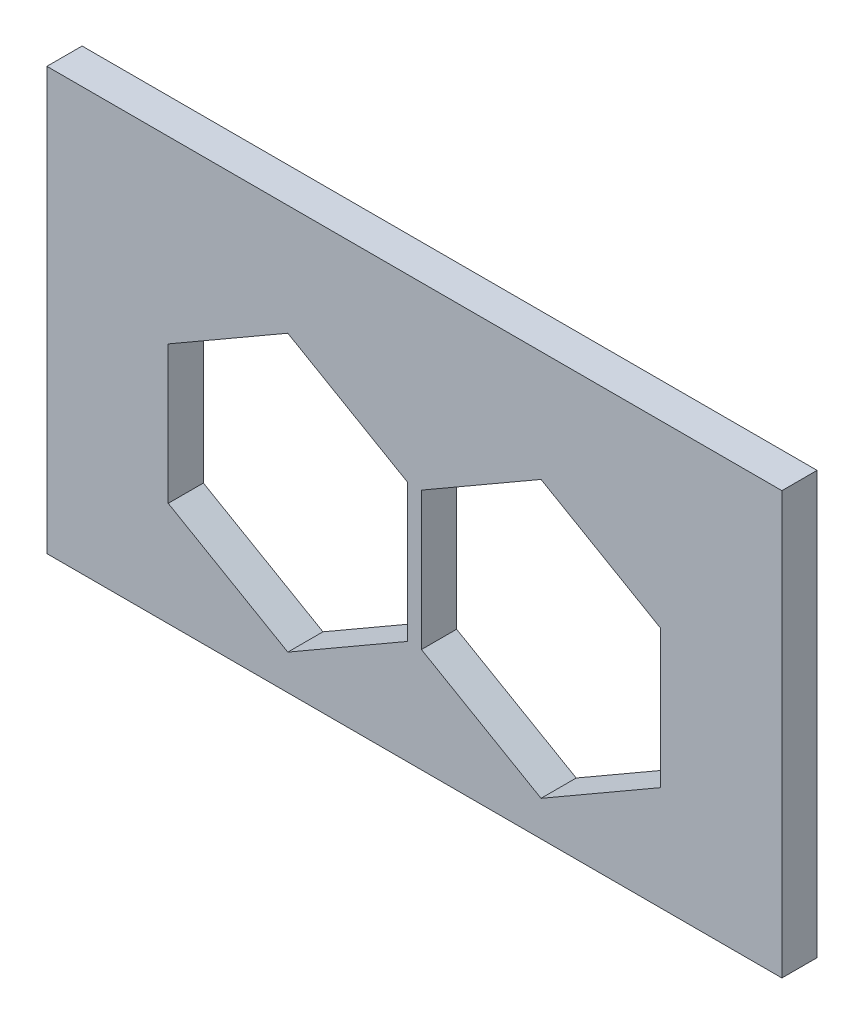
ISO-10303-21;
HEADER;
FILE_DESCRIPTION(('STEP AP214'),'2;1');
FILE_NAME('part.step','',(''),(''),'','','');
FILE_SCHEMA(('AUTOMOTIVE_DESIGN { 1 0 10303 214 1 1 1 1 }'));
ENDSEC;
DATA;
#1=APPLICATION_CONTEXT('core data for automotive mechanical design processes');
#2=APPLICATION_PROTOCOL_DEFINITION('international standard','automotive_design',2000,#1);
#3=PRODUCT_CONTEXT('',#1,'mechanical');
#4=PRODUCT('Part','Part','',(#3));
#5=PRODUCT_RELATED_PRODUCT_CATEGORY('part','',(#4));
#6=PRODUCT_DEFINITION_FORMATION('','',#4);
#7=PRODUCT_DEFINITION_CONTEXT('part definition',#1,'design');
#8=PRODUCT_DEFINITION('design','',#6,#7);
#9=PRODUCT_DEFINITION_SHAPE('','',#8);
#10=(LENGTH_UNIT() NAMED_UNIT(*) SI_UNIT(.MILLI.,.METRE.));
#11=(NAMED_UNIT(*) PLANE_ANGLE_UNIT() SI_UNIT($,.RADIAN.));
#12=(NAMED_UNIT(*) SI_UNIT($,.STERADIAN.) SOLID_ANGLE_UNIT());
#13=UNCERTAINTY_MEASURE_WITH_UNIT(LENGTH_MEASURE(1.E-05),#10,'distance_accuracy_value','');
#14=(GEOMETRIC_REPRESENTATION_CONTEXT(3) GLOBAL_UNCERTAINTY_ASSIGNED_CONTEXT((#13)) GLOBAL_UNIT_ASSIGNED_CONTEXT((#10,
#11,#12)) REPRESENTATION_CONTEXT('',''));
#15=CARTESIAN_POINT('',(0.,0.,0.));
#16=DIRECTION('',(0.,0.,1.));
#17=DIRECTION('',(1.,0.,0.));
#18=AXIS2_PLACEMENT_3D('',#15,#16,#17);
#19=CARTESIAN_POINT('',(0.,0.,3.175));
#20=DIRECTION('',(0.,0.,1.));
#21=DIRECTION('',(1.,0.,0.));
#22=AXIS2_PLACEMENT_3D('',#19,#20,#21);
#23=PLANE('',#22);
#24=DIRECTION('',(0.,-1.,0.));
#25=VECTOR('',#24,1.);
#26=CARTESIAN_POINT('',(-33.17494,-19.05,3.175));
#27=LINE('',#26,#25);
#28=CARTESIAN_POINT('',(-33.17494,19.05,3.175));
#29=VERTEX_POINT('',#28);
#30=CARTESIAN_POINT('',(-33.17494,-19.05,3.175));
#31=VERTEX_POINT('',#30);
#32=EDGE_CURVE('E285',#29,#31,#27,.T.);
#33=ORIENTED_EDGE('',*,*,#32,.T.);
#34=DIRECTION('',(1.,0.,0.));
#35=VECTOR('',#34,1.);
#36=CARTESIAN_POINT('',(33.17494,-19.05,3.175));
#37=LINE('',#36,#35);
#38=CARTESIAN_POINT('',(33.17494,-19.05,3.175));
#39=VERTEX_POINT('',#38);
#40=EDGE_CURVE('E289',#31,#39,#37,.T.);
#41=ORIENTED_EDGE('',*,*,#40,.T.);
#42=DIRECTION('',(0.,1.,0.));
#43=VECTOR('',#42,1.);
#44=CARTESIAN_POINT('',(33.17494,-19.05,3.175));
#45=LINE('',#44,#43);
#46=CARTESIAN_POINT('',(33.17494,19.05,3.175));
#47=VERTEX_POINT('',#46);
#48=EDGE_CURVE('E293',#39,#47,#45,.T.);
#49=ORIENTED_EDGE('',*,*,#48,.T.);
#50=DIRECTION('',(-1.,0.,0.));
#51=VECTOR('',#50,1.);
#52=CARTESIAN_POINT('',(33.17494,19.05,3.175));
#53=LINE('',#52,#51);
#54=EDGE_CURVE('E296',#47,#29,#53,.T.);
#55=ORIENTED_EDGE('',*,*,#54,.T.);
#56=EDGE_LOOP('',(#33,#41,#49,#55));
#57=FACE_BOUND('',#56,.T.);
#58=DIRECTION('',(0.866025403784439,0.5,0.));
#59=VECTOR('',#58,1.);
#60=CARTESIAN_POINT('',(11.43,-15.875,3.175));
#61=LINE('',#60,#59);
#62=CARTESIAN_POINT('',(11.43,-15.875,3.175));
#63=VERTEX_POINT('',#62);
#64=CARTESIAN_POINT('',(22.2250004660914,-9.64250357500002,3.175));
#65=VERTEX_POINT('',#64);
#66=EDGE_CURVE('E225',#63,#65,#61,.T.);
#67=ORIENTED_EDGE('',*,*,#66,.F.);
#68=DIRECTION('',(0.86602540378444,-0.499999999999999,0.));
#69=VECTOR('',#68,1.);
#70=CARTESIAN_POINT('',(0.634999533908611,-9.642503575,3.175));
#71=LINE('',#70,#69);
#72=CARTESIAN_POINT('',(0.634999533908611,-9.642503575,3.175));
#73=VERTEX_POINT('',#72);
#74=EDGE_CURVE('E222',#73,#63,#71,.T.);
#75=ORIENTED_EDGE('',*,*,#74,.F.);
#76=DIRECTION('',(0.,-1.,0.));
#77=VECTOR('',#76,1.);
#78=CARTESIAN_POINT('',(0.634999533908612,2.822489275,3.175));
#79=LINE('',#78,#77);
#80=CARTESIAN_POINT('',(0.634999533908612,2.822489275,3.175));
#81=VERTEX_POINT('',#80);
#82=EDGE_CURVE('E239',#81,#73,#79,.T.);
#83=ORIENTED_EDGE('',*,*,#82,.F.);
#84=DIRECTION('',(-0.866025403784439,-0.5,0.));
#85=VECTOR('',#84,1.);
#86=CARTESIAN_POINT('',(11.43,9.05498569999998,3.175));
#87=LINE('',#86,#85);
#88=CARTESIAN_POINT('',(11.43,9.05498569999998,3.175));
#89=VERTEX_POINT('',#88);
#90=EDGE_CURVE('E235',#89,#81,#87,.T.);
#91=ORIENTED_EDGE('',*,*,#90,.F.);
#92=DIRECTION('',(-0.866025403784439,0.499999999999999,0.));
#93=VECTOR('',#92,1.);
#94=CARTESIAN_POINT('',(22.2250004660914,2.82248927499998,3.175));
#95=LINE('',#94,#93);
#96=CARTESIAN_POINT('',(22.2250004660914,2.82248927499998,3.175));
#97=VERTEX_POINT('',#96);
#98=EDGE_CURVE('E232',#97,#89,#95,.T.);
#99=ORIENTED_EDGE('',*,*,#98,.F.);
#100=DIRECTION('',(0.,1.,0.));
#101=VECTOR('',#100,1.);
#102=CARTESIAN_POINT('',(22.2250004660914,-9.64250357500002,3.175));
#103=LINE('',#102,#101);
#104=EDGE_CURVE('E229',#65,#97,#103,.T.);
#105=ORIENTED_EDGE('',*,*,#104,.F.);
#106=EDGE_LOOP('',(#67,#75,#83,#91,#99,#105));
#107=FACE_BOUND('',#106,.T.);
#108=DIRECTION('',(-0.866025403784439,0.5,0.));
#109=VECTOR('',#108,1.);
#110=CARTESIAN_POINT('',(-11.43,9.05498569999998,3.175));
#111=LINE('',#110,#109);
#112=CARTESIAN_POINT('',(-0.634999533908612,2.822489275,3.175));
#113=VERTEX_POINT('',#112);
#114=CARTESIAN_POINT('',(-11.43,9.05498569999998,3.175));
#115=VERTEX_POINT('',#114);
#116=EDGE_CURVE('E162',#113,#115,#111,.T.);
#117=ORIENTED_EDGE('',*,*,#116,.F.);
#118=DIRECTION('',(0.,1.,0.));
#119=VECTOR('',#118,1.);
#120=CARTESIAN_POINT('',(-0.634999533908612,2.822489275,3.175));
#121=LINE('',#120,#119);
#122=CARTESIAN_POINT('',(-0.634999533908611,-9.642503575,3.175));
#123=VERTEX_POINT('',#122);
#124=EDGE_CURVE('E153',#123,#113,#121,.T.);
#125=ORIENTED_EDGE('',*,*,#124,.F.);
#126=DIRECTION('',(0.86602540378444,0.499999999999998,0.));
#127=VECTOR('',#126,1.);
#128=CARTESIAN_POINT('',(-0.634999533908611,-9.642503575,3.175));
#129=LINE('',#128,#127);
#130=CARTESIAN_POINT('',(-11.43,-15.875,3.175));
#131=VERTEX_POINT('',#130);
#132=EDGE_CURVE('E188',#131,#123,#129,.T.);
#133=ORIENTED_EDGE('',*,*,#132,.F.);
#134=DIRECTION('',(0.866025403784439,-0.5,0.));
#135=VECTOR('',#134,1.);
#136=CARTESIAN_POINT('',(-11.43,-15.875,3.175));
#137=LINE('',#136,#135);
#138=CARTESIAN_POINT('',(-22.2250004660914,-9.64250357500002,3.175));
#139=VERTEX_POINT('',#138);
#140=EDGE_CURVE('E185',#139,#131,#137,.T.);
#141=ORIENTED_EDGE('',*,*,#140,.F.);
#142=DIRECTION('',(0.,-1.,0.));
#143=VECTOR('',#142,1.);
#144=CARTESIAN_POINT('',(-22.2250004660914,-9.64250357500002,3.175));
#145=LINE('',#144,#143);
#146=CARTESIAN_POINT('',(-22.2250004660914,2.82248927499998,3.175));
#147=VERTEX_POINT('',#146);
#148=EDGE_CURVE('E180',#147,#139,#145,.T.);
#149=ORIENTED_EDGE('',*,*,#148,.F.);
#150=DIRECTION('',(-0.866025403784439,-0.499999999999999,0.));
#151=VECTOR('',#150,1.);
#152=CARTESIAN_POINT('',(-22.2250004660914,2.82248927499998,3.175));
#153=LINE('',#152,#151);
#154=EDGE_CURVE('E176',#115,#147,#153,.T.);
#155=ORIENTED_EDGE('',*,*,#154,.F.);
#156=EDGE_LOOP('',(#117,#125,#133,#141,#149,#155));
#157=FACE_BOUND('',#156,.T.);
#158=ADVANCED_FACE('F39',(#57,#107,#157),#23,.T.);
#159=CARTESIAN_POINT('',(0.,0.,0.));
#160=DIRECTION('',(0.,0.,1.));
#161=DIRECTION('',(1.,0.,0.));
#162=AXIS2_PLACEMENT_3D('',#159,#160,#161);
#163=PLANE('',#162);
#164=DIRECTION('',(0.86602540378444,-0.499999999999999,0.));
#165=VECTOR('',#164,1.);
#166=CARTESIAN_POINT('',(0.634999533908611,-9.642503575,0.));
#167=LINE('',#166,#165);
#168=CARTESIAN_POINT('',(0.634999533908611,-9.642503575,0.));
#169=VERTEX_POINT('',#168);
#170=CARTESIAN_POINT('',(11.43,-15.875,0.));
#171=VERTEX_POINT('',#170);
#172=EDGE_CURVE('E171',#169,#171,#167,.T.);
#173=ORIENTED_EDGE('',*,*,#172,.T.);
#174=DIRECTION('',(0.866025403784439,0.5,0.));
#175=VECTOR('',#174,1.);
#176=CARTESIAN_POINT('',(11.43,-15.875,0.));
#177=LINE('',#176,#175);
#178=CARTESIAN_POINT('',(22.2250004660914,-9.64250357500002,0.));
#179=VERTEX_POINT('',#178);
#180=EDGE_CURVE('E246',#171,#179,#177,.T.);
#181=ORIENTED_EDGE('',*,*,#180,.T.);
#182=DIRECTION('',(0.,1.,0.));
#183=VECTOR('',#182,1.);
#184=CARTESIAN_POINT('',(22.2250004660914,-9.64250357500002,0.));
#185=LINE('',#184,#183);
#186=CARTESIAN_POINT('',(22.2250004660914,2.82248927499998,0.));
#187=VERTEX_POINT('',#186);
#188=EDGE_CURVE('E250',#179,#187,#185,.T.);
#189=ORIENTED_EDGE('',*,*,#188,.T.);
#190=DIRECTION('',(-0.866025403784439,0.499999999999999,0.));
#191=VECTOR('',#190,1.);
#192=CARTESIAN_POINT('',(22.2250004660914,2.82248927499998,0.));
#193=LINE('',#192,#191);
#194=CARTESIAN_POINT('',(11.43,9.05498569999998,0.));
#195=VERTEX_POINT('',#194);
#196=EDGE_CURVE('E254',#187,#195,#193,.T.);
#197=ORIENTED_EDGE('',*,*,#196,.T.);
#198=DIRECTION('',(-0.866025403784439,-0.5,0.));
#199=VECTOR('',#198,1.);
#200=CARTESIAN_POINT('',(11.43,9.05498569999998,0.));
#201=LINE('',#200,#199);
#202=CARTESIAN_POINT('',(0.634999533908612,2.822489275,0.));
#203=VERTEX_POINT('',#202);
#204=EDGE_CURVE('E258',#195,#203,#201,.T.);
#205=ORIENTED_EDGE('',*,*,#204,.T.);
#206=DIRECTION('',(0.,-1.,0.));
#207=VECTOR('',#206,1.);
#208=CARTESIAN_POINT('',(0.634999533908612,2.822489275,0.));
#209=LINE('',#208,#207);
#210=EDGE_CURVE('E226',#203,#169,#209,.T.);
#211=ORIENTED_EDGE('',*,*,#210,.T.);
#212=EDGE_LOOP('',(#173,#181,#189,#197,#205,#211));
#213=FACE_BOUND('',#212,.T.);
#214=DIRECTION('',(0.,-1.,0.));
#215=VECTOR('',#214,1.);
#216=CARTESIAN_POINT('',(-33.17494,-19.05,0.));
#217=LINE('',#216,#215);
#218=CARTESIAN_POINT('',(-33.17494,19.05,0.));
#219=VERTEX_POINT('',#218);
#220=CARTESIAN_POINT('',(-33.17494,-19.05,0.));
#221=VERTEX_POINT('',#220);
#222=EDGE_CURVE('E284',#219,#221,#217,.T.);
#223=ORIENTED_EDGE('',*,*,#222,.F.);
#224=DIRECTION('',(-1.,0.,0.));
#225=VECTOR('',#224,1.);
#226=CARTESIAN_POINT('',(33.17494,19.05,0.));
#227=LINE('',#226,#225);
#228=CARTESIAN_POINT('',(33.17494,19.05,0.));
#229=VERTEX_POINT('',#228);
#230=EDGE_CURVE('E290',#229,#219,#227,.T.);
#231=ORIENTED_EDGE('',*,*,#230,.F.);
#232=DIRECTION('',(0.,1.,0.));
#233=VECTOR('',#232,1.);
#234=CARTESIAN_POINT('',(33.17494,-19.05,0.));
#235=LINE('',#234,#233);
#236=CARTESIAN_POINT('',(33.17494,-19.05,0.));
#237=VERTEX_POINT('',#236);
#238=EDGE_CURVE('E306',#237,#229,#235,.T.);
#239=ORIENTED_EDGE('',*,*,#238,.F.);
#240=DIRECTION('',(1.,0.,0.));
#241=VECTOR('',#240,1.);
#242=CARTESIAN_POINT('',(33.17494,-19.05,0.));
#243=LINE('',#242,#241);
#244=EDGE_CURVE('E303',#221,#237,#243,.T.);
#245=ORIENTED_EDGE('',*,*,#244,.F.);
#246=EDGE_LOOP('',(#223,#231,#239,#245));
#247=FACE_BOUND('',#246,.T.);
#248=DIRECTION('',(0.,1.,0.));
#249=VECTOR('',#248,1.);
#250=CARTESIAN_POINT('',(-0.634999533908612,2.822489275,0.));
#251=LINE('',#250,#249);
#252=CARTESIAN_POINT('',(-0.63499953390861,-9.642503575,0.));
#253=VERTEX_POINT('',#252);
#254=CARTESIAN_POINT('',(-0.634999533908612,2.822489275,0.));
#255=VERTEX_POINT('',#254);
#256=EDGE_CURVE('E63',#253,#255,#251,.T.);
#257=ORIENTED_EDGE('',*,*,#256,.T.);
#258=DIRECTION('',(-0.866025403784439,0.5,0.));
#259=VECTOR('',#258,1.);
#260=CARTESIAN_POINT('',(-11.43,9.05498569999998,0.));
#261=LINE('',#260,#259);
#262=CARTESIAN_POINT('',(-11.43,9.05498569999998,0.));
#263=VERTEX_POINT('',#262);
#264=EDGE_CURVE('E169',#255,#263,#261,.T.);
#265=ORIENTED_EDGE('',*,*,#264,.T.);
#266=DIRECTION('',(-0.866025403784439,-0.499999999999999,0.));
#267=VECTOR('',#266,1.);
#268=CARTESIAN_POINT('',(-22.2250004660914,2.82248927499998,0.));
#269=LINE('',#268,#267);
#270=CARTESIAN_POINT('',(-22.2250004660914,2.82248927499998,0.));
#271=VERTEX_POINT('',#270);
#272=EDGE_CURVE('E195',#263,#271,#269,.T.);
#273=ORIENTED_EDGE('',*,*,#272,.T.);
#274=DIRECTION('',(0.,-1.,0.));
#275=VECTOR('',#274,1.);
#276=CARTESIAN_POINT('',(-22.2250004660914,-9.64250357500002,0.));
#277=LINE('',#276,#275);
#278=CARTESIAN_POINT('',(-22.2250004660914,-9.64250357500002,0.));
#279=VERTEX_POINT('',#278);
#280=EDGE_CURVE('E199',#271,#279,#277,.T.);
#281=ORIENTED_EDGE('',*,*,#280,.T.);
#282=DIRECTION('',(0.866025403784439,-0.5,0.));
#283=VECTOR('',#282,1.);
#284=CARTESIAN_POINT('',(-11.43,-15.875,0.));
#285=LINE('',#284,#283);
#286=CARTESIAN_POINT('',(-11.43,-15.875,0.));
#287=VERTEX_POINT('',#286);
#288=EDGE_CURVE('E203',#279,#287,#285,.T.);
#289=ORIENTED_EDGE('',*,*,#288,.T.);
#290=DIRECTION('',(0.86602540378444,0.499999999999998,0.));
#291=VECTOR('',#290,1.);
#292=CARTESIAN_POINT('',(-0.634999533908611,-9.642503575,0.));
#293=LINE('',#292,#291);
#294=EDGE_CURVE('E163',#287,#253,#293,.T.);
#295=ORIENTED_EDGE('',*,*,#294,.T.);
#296=EDGE_LOOP('',(#257,#265,#273,#281,#289,#295));
#297=FACE_BOUND('',#296,.T.);
#298=ADVANCED_FACE('F329',(#213,#247,#297),#163,.F.);
#299=CARTESIAN_POINT('',(-33.17494,-19.05,3.175));
#300=DIRECTION('',(1.,0.,0.));
#301=DIRECTION('',(0.,0.,-1.));
#302=AXIS2_PLACEMENT_3D('',#299,#300,#301);
#303=PLANE('',#302);
#304=ORIENTED_EDGE('',*,*,#222,.T.);
#305=DIRECTION('',(0.,0.,-1.));
#306=VECTOR('',#305,1.);
#307=CARTESIAN_POINT('',(-33.17494,-19.05,3.175));
#308=LINE('',#307,#306);
#309=EDGE_CURVE('E11',#31,#221,#308,.T.);
#310=ORIENTED_EDGE('',*,*,#309,.F.);
#311=ORIENTED_EDGE('',*,*,#32,.F.);
#312=DIRECTION('',(0.,0.,-1.));
#313=VECTOR('',#312,1.);
#314=CARTESIAN_POINT('',(-33.17494,19.05,3.175));
#315=LINE('',#314,#313);
#316=EDGE_CURVE('E299',#29,#219,#315,.T.);
#317=ORIENTED_EDGE('',*,*,#316,.T.);
#318=EDGE_LOOP('',(#304,#310,#311,#317));
#319=FACE_BOUND('',#318,.T.);
#320=ADVANCED_FACE('F41',(#319),#303,.F.);
#321=CARTESIAN_POINT('',(33.17494,-19.05,3.175));
#322=DIRECTION('',(0.,1.,0.));
#323=DIRECTION('',(0.,0.,1.));
#324=AXIS2_PLACEMENT_3D('',#321,#322,#323);
#325=PLANE('',#324);
#326=ORIENTED_EDGE('',*,*,#244,.T.);
#327=DIRECTION('',(0.,0.,-1.));
#328=VECTOR('',#327,1.);
#329=CARTESIAN_POINT('',(33.17494,-19.05,3.175));
#330=LINE('',#329,#328);
#331=EDGE_CURVE('E48',#39,#237,#330,.T.);
#332=ORIENTED_EDGE('',*,*,#331,.F.);
#333=ORIENTED_EDGE('',*,*,#40,.F.);
#334=ORIENTED_EDGE('',*,*,#309,.T.);
#335=EDGE_LOOP('',(#326,#332,#333,#334));
#336=FACE_BOUND('',#335,.T.);
#337=ADVANCED_FACE('F340',(#336),#325,.F.);
#338=CARTESIAN_POINT('',(33.17494,-19.05,3.175));
#339=DIRECTION('',(-1.,0.,0.));
#340=DIRECTION('',(0.,0.,1.));
#341=AXIS2_PLACEMENT_3D('',#338,#339,#340);
#342=PLANE('',#341);
#343=ORIENTED_EDGE('',*,*,#238,.T.);
#344=DIRECTION('',(0.,0.,-1.));
#345=VECTOR('',#344,1.);
#346=CARTESIAN_POINT('',(33.17494,19.05,3.175));
#347=LINE('',#346,#345);
#348=EDGE_CURVE('E314',#47,#229,#347,.T.);
#349=ORIENTED_EDGE('',*,*,#348,.F.);
#350=ORIENTED_EDGE('',*,*,#48,.F.);
#351=ORIENTED_EDGE('',*,*,#331,.T.);
#352=EDGE_LOOP('',(#343,#349,#350,#351));
#353=FACE_BOUND('',#352,.T.);
#354=ADVANCED_FACE('F323',(#353),#342,.F.);
#355=CARTESIAN_POINT('',(33.17494,19.05,3.175));
#356=DIRECTION('',(0.,-1.,0.));
#357=DIRECTION('',(0.,0.,-1.));
#358=AXIS2_PLACEMENT_3D('',#355,#356,#357);
#359=PLANE('',#358);
#360=ORIENTED_EDGE('',*,*,#230,.T.);
#361=ORIENTED_EDGE('',*,*,#316,.F.);
#362=ORIENTED_EDGE('',*,*,#54,.F.);
#363=ORIENTED_EDGE('',*,*,#348,.T.);
#364=EDGE_LOOP('',(#360,#361,#362,#363));
#365=FACE_BOUND('',#364,.T.);
#366=ADVANCED_FACE('F333',(#365),#359,.F.);
#367=CARTESIAN_POINT('',(0.634999533908611,-9.642503575,3.175));
#368=DIRECTION('',(0.499999999999999,0.866025403784439,0.));
#369=DIRECTION('',(-0.866025403784439,0.499999999999999,0.));
#370=AXIS2_PLACEMENT_3D('',#367,#368,#369);
#371=PLANE('',#370);
#372=ORIENTED_EDGE('',*,*,#172,.F.);
#373=DIRECTION('',(0.,0.,-1.));
#374=VECTOR('',#373,1.);
#375=CARTESIAN_POINT('',(0.634999533908611,-9.642503575,3.175));
#376=LINE('',#375,#374);
#377=EDGE_CURVE('E242',#73,#169,#376,.T.);
#378=ORIENTED_EDGE('',*,*,#377,.F.);
#379=ORIENTED_EDGE('',*,*,#74,.T.);
#380=DIRECTION('',(0.,0.,-1.));
#381=VECTOR('',#380,1.);
#382=CARTESIAN_POINT('',(11.43,-15.875,3.175));
#383=LINE('',#382,#381);
#384=EDGE_CURVE('E280',#63,#171,#383,.T.);
#385=ORIENTED_EDGE('',*,*,#384,.T.);
#386=EDGE_LOOP('',(#372,#378,#379,#385));
#387=FACE_BOUND('',#386,.T.);
#388=ADVANCED_FACE('F355',(#387),#371,.T.);
#389=CARTESIAN_POINT('',(11.43,-15.875,3.175));
#390=DIRECTION('',(-0.5,0.866025403784439,0.));
#391=DIRECTION('',(-0.866025403784439,-0.5,0.));
#392=AXIS2_PLACEMENT_3D('',#389,#390,#391);
#393=PLANE('',#392);
#394=ORIENTED_EDGE('',*,*,#180,.F.);
#395=ORIENTED_EDGE('',*,*,#384,.F.);
#396=ORIENTED_EDGE('',*,*,#66,.T.);
#397=DIRECTION('',(0.,0.,-1.));
#398=VECTOR('',#397,1.);
#399=CARTESIAN_POINT('',(22.2250004660914,-9.64250357500002,3.175));
#400=LINE('',#399,#398);
#401=EDGE_CURVE('E277',#65,#179,#400,.T.);
#402=ORIENTED_EDGE('',*,*,#401,.T.);
#403=EDGE_LOOP('',(#394,#395,#396,#402));
#404=FACE_BOUND('',#403,.T.);
#405=ADVANCED_FACE('F362',(#404),#393,.T.);
#406=CARTESIAN_POINT('',(22.2250004660914,-9.64250357500002,3.175));
#407=DIRECTION('',(-1.,0.,0.));
#408=DIRECTION('',(0.,0.,1.));
#409=AXIS2_PLACEMENT_3D('',#406,#407,#408);
#410=PLANE('',#409);
#411=ORIENTED_EDGE('',*,*,#188,.F.);
#412=ORIENTED_EDGE('',*,*,#401,.F.);
#413=ORIENTED_EDGE('',*,*,#104,.T.);
#414=DIRECTION('',(0.,0.,-1.));
#415=VECTOR('',#414,1.);
#416=CARTESIAN_POINT('',(22.2250004660914,2.82248927499998,3.175));
#417=LINE('',#416,#415);
#418=EDGE_CURVE('E274',#97,#187,#417,.T.);
#419=ORIENTED_EDGE('',*,*,#418,.T.);
#420=EDGE_LOOP('',(#411,#412,#413,#419));
#421=FACE_BOUND('',#420,.T.);
#422=ADVANCED_FACE('F367',(#421),#410,.T.);
#423=CARTESIAN_POINT('',(22.2250004660914,2.82248927499998,3.175));
#424=DIRECTION('',(-0.499999999999999,-0.866025403784439,0.));
#425=DIRECTION('',(0.866025403784439,-0.499999999999999,0.));
#426=AXIS2_PLACEMENT_3D('',#423,#424,#425);
#427=PLANE('',#426);
#428=ORIENTED_EDGE('',*,*,#196,.F.);
#429=ORIENTED_EDGE('',*,*,#418,.F.);
#430=ORIENTED_EDGE('',*,*,#98,.T.);
#431=DIRECTION('',(0.,0.,-1.));
#432=VECTOR('',#431,1.);
#433=CARTESIAN_POINT('',(11.43,9.05498569999998,3.175));
#434=LINE('',#433,#432);
#435=EDGE_CURVE('E271',#89,#195,#434,.T.);
#436=ORIENTED_EDGE('',*,*,#435,.T.);
#437=EDGE_LOOP('',(#428,#429,#430,#436));
#438=FACE_BOUND('',#437,.T.);
#439=ADVANCED_FACE('F390',(#438),#427,.T.);
#440=CARTESIAN_POINT('',(11.43,9.05498569999998,3.175));
#441=DIRECTION('',(0.5,-0.866025403784439,0.));
#442=DIRECTION('',(0.866025403784439,0.5,0.));
#443=AXIS2_PLACEMENT_3D('',#440,#441,#442);
#444=PLANE('',#443);
#445=ORIENTED_EDGE('',*,*,#204,.F.);
#446=ORIENTED_EDGE('',*,*,#435,.F.);
#447=ORIENTED_EDGE('',*,*,#90,.T.);
#448=DIRECTION('',(0.,0.,-1.));
#449=VECTOR('',#448,1.);
#450=CARTESIAN_POINT('',(0.634999533908612,2.822489275,3.175));
#451=LINE('',#450,#449);
#452=EDGE_CURVE('E268',#81,#203,#451,.T.);
#453=ORIENTED_EDGE('',*,*,#452,.T.);
#454=EDGE_LOOP('',(#445,#446,#447,#453));
#455=FACE_BOUND('',#454,.T.);
#456=ADVANCED_FACE('F380',(#455),#444,.T.);
#457=CARTESIAN_POINT('',(0.634999533908612,2.822489275,3.175));
#458=DIRECTION('',(1.,0.,0.));
#459=DIRECTION('',(0.,1.,0.));
#460=AXIS2_PLACEMENT_3D('',#457,#458,#459);
#461=PLANE('',#460);
#462=ORIENTED_EDGE('',*,*,#210,.F.);
#463=ORIENTED_EDGE('',*,*,#452,.F.);
#464=ORIENTED_EDGE('',*,*,#82,.T.);
#465=ORIENTED_EDGE('',*,*,#377,.T.);
#466=EDGE_LOOP('',(#462,#463,#464,#465));
#467=FACE_BOUND('',#466,.T.);
#468=ADVANCED_FACE('F374',(#467),#461,.T.);
#469=CARTESIAN_POINT('',(-0.634999533908612,2.822489275,3.175));
#470=DIRECTION('',(-1.,0.,0.));
#471=DIRECTION('',(0.,-1.,0.));
#472=AXIS2_PLACEMENT_3D('',#469,#470,#471);
#473=PLANE('',#472);
#474=ORIENTED_EDGE('',*,*,#256,.F.);
#475=DIRECTION('',(0.,0.,-1.));
#476=VECTOR('',#475,1.);
#477=CARTESIAN_POINT('',(-0.634999533908611,-9.642503575,3.175));
#478=LINE('',#477,#476);
#479=EDGE_CURVE('E157',#123,#253,#478,.T.);
#480=ORIENTED_EDGE('',*,*,#479,.F.);
#481=ORIENTED_EDGE('',*,*,#124,.T.);
#482=DIRECTION('',(0.,0.,-1.));
#483=VECTOR('',#482,1.);
#484=CARTESIAN_POINT('',(-0.634999533908612,2.822489275,3.175));
#485=LINE('',#484,#483);
#486=EDGE_CURVE('E156',#113,#255,#485,.T.);
#487=ORIENTED_EDGE('',*,*,#486,.T.);
#488=EDGE_LOOP('',(#474,#480,#481,#487));
#489=FACE_BOUND('',#488,.T.);
#490=ADVANCED_FACE('F155',(#489),#473,.T.);
#491=CARTESIAN_POINT('',(-11.43,9.05498569999998,3.175));
#492=DIRECTION('',(-0.5,-0.866025403784439,0.));
#493=DIRECTION('',(0.866025403784439,-0.5,0.));
#494=AXIS2_PLACEMENT_3D('',#491,#492,#493);
#495=PLANE('',#494);
#496=ORIENTED_EDGE('',*,*,#264,.F.);
#497=ORIENTED_EDGE('',*,*,#486,.F.);
#498=ORIENTED_EDGE('',*,*,#116,.T.);
#499=DIRECTION('',(0.,0.,-1.));
#500=VECTOR('',#499,1.);
#501=CARTESIAN_POINT('',(-11.43,9.05498569999998,3.175));
#502=LINE('',#501,#500);
#503=EDGE_CURVE('E172',#115,#263,#502,.T.);
#504=ORIENTED_EDGE('',*,*,#503,.T.);
#505=EDGE_LOOP('',(#496,#497,#498,#504));
#506=FACE_BOUND('',#505,.T.);
#507=ADVANCED_FACE('F166',(#506),#495,.T.);
#508=CARTESIAN_POINT('',(-22.2250004660914,2.82248927499998,3.175));
#509=DIRECTION('',(0.499999999999999,-0.866025403784439,0.));
#510=DIRECTION('',(0.866025403784439,0.499999999999999,0.));
#511=AXIS2_PLACEMENT_3D('',#508,#509,#510);
#512=PLANE('',#511);
#513=ORIENTED_EDGE('',*,*,#272,.F.);
#514=ORIENTED_EDGE('',*,*,#503,.F.);
#515=ORIENTED_EDGE('',*,*,#154,.T.);
#516=DIRECTION('',(0.,0.,-1.));
#517=VECTOR('',#516,1.);
#518=CARTESIAN_POINT('',(-22.2250004660914,2.82248927499998,3.175));
#519=LINE('',#518,#517);
#520=EDGE_CURVE('E217',#147,#271,#519,.T.);
#521=ORIENTED_EDGE('',*,*,#520,.T.);
#522=EDGE_LOOP('',(#513,#514,#515,#521));
#523=FACE_BOUND('',#522,.T.);
#524=ADVANCED_FACE('F406',(#523),#512,.T.);
#525=CARTESIAN_POINT('',(-22.2250004660914,-9.64250357500002,3.175));
#526=DIRECTION('',(1.,0.,0.));
#527=DIRECTION('',(0.,0.,-1.));
#528=AXIS2_PLACEMENT_3D('',#525,#526,#527);
#529=PLANE('',#528);
#530=ORIENTED_EDGE('',*,*,#280,.F.);
#531=ORIENTED_EDGE('',*,*,#520,.F.);
#532=ORIENTED_EDGE('',*,*,#148,.T.);
#533=DIRECTION('',(0.,0.,-1.));
#534=VECTOR('',#533,1.);
#535=CARTESIAN_POINT('',(-22.2250004660914,-9.64250357500002,3.175));
#536=LINE('',#535,#534);
#537=EDGE_CURVE('E214',#139,#279,#536,.T.);
#538=ORIENTED_EDGE('',*,*,#537,.T.);
#539=EDGE_LOOP('',(#530,#531,#532,#538));
#540=FACE_BOUND('',#539,.T.);
#541=ADVANCED_FACE('F409',(#540),#529,.T.);
#542=CARTESIAN_POINT('',(-11.43,-15.875,3.175));
#543=DIRECTION('',(0.5,0.866025403784439,0.));
#544=DIRECTION('',(-0.866025403784439,0.5,0.));
#545=AXIS2_PLACEMENT_3D('',#542,#543,#544);
#546=PLANE('',#545);
#547=ORIENTED_EDGE('',*,*,#288,.F.);
#548=ORIENTED_EDGE('',*,*,#537,.F.);
#549=ORIENTED_EDGE('',*,*,#140,.T.);
#550=DIRECTION('',(0.,0.,-1.));
#551=VECTOR('',#550,1.);
#552=CARTESIAN_POINT('',(-11.43,-15.875,3.175));
#553=LINE('',#552,#551);
#554=EDGE_CURVE('E55',#131,#287,#553,.T.);
#555=ORIENTED_EDGE('',*,*,#554,.T.);
#556=EDGE_LOOP('',(#547,#548,#549,#555));
#557=FACE_BOUND('',#556,.T.);
#558=ADVANCED_FACE('F413',(#557),#546,.T.);
#559=CARTESIAN_POINT('',(-0.634999533908611,-9.642503575,3.175));
#560=DIRECTION('',(-0.499999999999998,0.86602540378444,0.));
#561=DIRECTION('',(-0.86602540378444,-0.499999999999998,0.));
#562=AXIS2_PLACEMENT_3D('',#559,#560,#561);
#563=PLANE('',#562);
#564=ORIENTED_EDGE('',*,*,#294,.F.);
#565=ORIENTED_EDGE('',*,*,#554,.F.);
#566=ORIENTED_EDGE('',*,*,#132,.T.);
#567=ORIENTED_EDGE('',*,*,#479,.T.);
#568=EDGE_LOOP('',(#564,#565,#566,#567));
#569=FACE_BOUND('',#568,.T.);
#570=ADVANCED_FACE('F417',(#569),#563,.T.);
#571=CLOSED_SHELL('',(#158,#298,#320,#337,#354,#366,#388,#405,#422,#439,#456,#468,#490,#507,
#524,#541,#558,#570));
#572=MANIFOLD_SOLID_BREP('B2',#571);
#573=ADVANCED_BREP_SHAPE_REPRESENTATION('',(#18,#572),#14);
#574=SHAPE_DEFINITION_REPRESENTATION(#9,#573);
ENDSEC;
END-ISO-10303-21;
